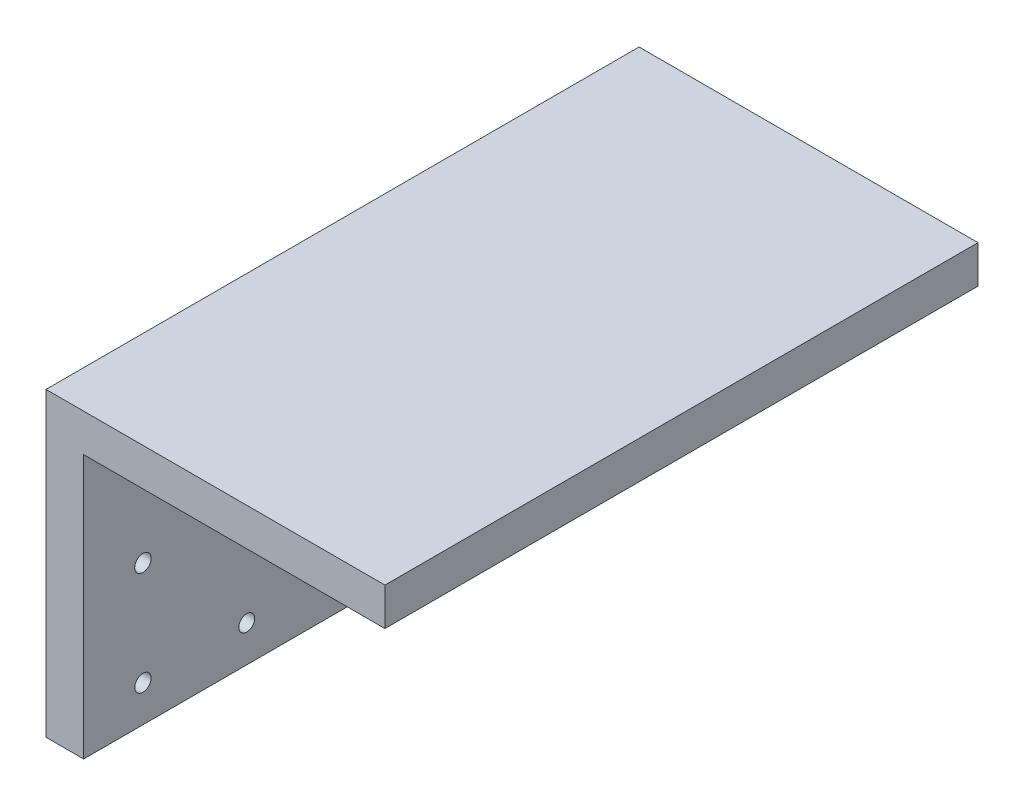
ISO-10303-21;
HEADER;
FILE_DESCRIPTION(('STEP AP214'),'2;1');
FILE_NAME('part.step','',(''),(''),'','','');
FILE_SCHEMA(('AUTOMOTIVE_DESIGN { 1 0 10303 214 1 1 1 1 }'));
ENDSEC;
DATA;
#1=APPLICATION_CONTEXT('core data for automotive mechanical design processes');
#2=APPLICATION_PROTOCOL_DEFINITION('international standard','automotive_design',2000,#1);
#3=PRODUCT_CONTEXT('',#1,'mechanical');
#4=PRODUCT('Part','Part','',(#3));
#5=PRODUCT_RELATED_PRODUCT_CATEGORY('part','',(#4));
#6=PRODUCT_DEFINITION_FORMATION('','',#4);
#7=PRODUCT_DEFINITION_CONTEXT('part definition',#1,'design');
#8=PRODUCT_DEFINITION('design','',#6,#7);
#9=PRODUCT_DEFINITION_SHAPE('','',#8);
#10=(LENGTH_UNIT() NAMED_UNIT(*) SI_UNIT(.MILLI.,.METRE.));
#11=(NAMED_UNIT(*) PLANE_ANGLE_UNIT() SI_UNIT($,.RADIAN.));
#12=(NAMED_UNIT(*) SI_UNIT($,.STERADIAN.) SOLID_ANGLE_UNIT());
#13=UNCERTAINTY_MEASURE_WITH_UNIT(LENGTH_MEASURE(1.E-05),#10,'distance_accuracy_value','');
#14=(GEOMETRIC_REPRESENTATION_CONTEXT(3) GLOBAL_UNCERTAINTY_ASSIGNED_CONTEXT((#13)) GLOBAL_UNIT_ASSIGNED_CONTEXT((#10,
#11,#12)) REPRESENTATION_CONTEXT('',''));
#15=CARTESIAN_POINT('',(0.,0.,0.));
#16=DIRECTION('',(0.,0.,1.));
#17=DIRECTION('',(1.,0.,0.));
#18=AXIS2_PLACEMENT_3D('',#15,#16,#17);
#19=CARTESIAN_POINT('',(12.7,-50.8,100.));
#20=DIRECTION('',(0.,0.,-1.));
#21=DIRECTION('',(-1.,0.,0.));
#22=AXIS2_PLACEMENT_3D('',#19,#20,#21);
#23=PLANE('',#22);
#24=DIRECTION('',(0.,-1.,0.));
#25=VECTOR('',#24,1.);
#26=CARTESIAN_POINT('',(0.,-50.8,100.));
#27=LINE('',#26,#25);
#28=CARTESIAN_POINT('',(0.,50.8,100.));
#29=VERTEX_POINT('',#28);
#30=CARTESIAN_POINT('',(0.,-50.8,100.));
#31=VERTEX_POINT('',#30);
#32=EDGE_CURVE('E95',#29,#31,#27,.T.);
#33=ORIENTED_EDGE('',*,*,#32,.T.);
#34=DIRECTION('',(-1.,0.,0.));
#35=VECTOR('',#34,1.);
#36=CARTESIAN_POINT('',(12.7,-50.8,100.));
#37=LINE('',#36,#35);
#38=CARTESIAN_POINT('',(12.7,-50.8,100.));
#39=VERTEX_POINT('',#38);
#40=EDGE_CURVE('E11',#39,#31,#37,.T.);
#41=ORIENTED_EDGE('',*,*,#40,.F.);
#42=DIRECTION('',(0.,-1.,0.));
#43=VECTOR('',#42,1.);
#44=CARTESIAN_POINT('',(12.7,-50.8,100.));
#45=LINE('',#44,#43);
#46=CARTESIAN_POINT('',(12.7,38.1,100.));
#47=VERTEX_POINT('',#46);
#48=EDGE_CURVE('E88',#47,#39,#45,.T.);
#49=ORIENTED_EDGE('',*,*,#48,.F.);
#50=DIRECTION('',(-1.,0.,0.));
#51=VECTOR('',#50,1.);
#52=CARTESIAN_POINT('',(114.3,38.1,100.));
#53=LINE('',#52,#51);
#54=CARTESIAN_POINT('',(114.3,38.1,100.));
#55=VERTEX_POINT('',#54);
#56=EDGE_CURVE('E103',#55,#47,#53,.T.);
#57=ORIENTED_EDGE('',*,*,#56,.F.);
#58=DIRECTION('',(0.,-1.,0.));
#59=VECTOR('',#58,1.);
#60=CARTESIAN_POINT('',(114.3,50.8,100.));
#61=LINE('',#60,#59);
#62=CARTESIAN_POINT('',(114.3,50.8,100.));
#63=VERTEX_POINT('',#62);
#64=EDGE_CURVE('E98',#63,#55,#61,.T.);
#65=ORIENTED_EDGE('',*,*,#64,.F.);
#66=DIRECTION('',(-1.,0.,0.));
#67=VECTOR('',#66,1.);
#68=CARTESIAN_POINT('',(12.7,50.8,100.));
#69=LINE('',#68,#67);
#70=EDGE_CURVE('E81',#63,#29,#69,.T.);
#71=ORIENTED_EDGE('',*,*,#70,.T.);
#72=EDGE_LOOP('',(#33,#41,#49,#57,#65,#71));
#73=FACE_BOUND('',#72,.T.);
#74=ADVANCED_FACE('F35',(#73),#23,.F.);
#75=CARTESIAN_POINT('',(12.7,-50.8,-100.));
#76=DIRECTION('',(0.,1.,0.));
#77=DIRECTION('',(0.,0.,1.));
#78=AXIS2_PLACEMENT_3D('',#75,#76,#77);
#79=PLANE('',#78);
#80=DIRECTION('',(0.,0.,-1.));
#81=VECTOR('',#80,1.);
#82=CARTESIAN_POINT('',(0.,-50.8,-100.));
#83=LINE('',#82,#81);
#84=CARTESIAN_POINT('',(0.,-50.8,-100.));
#85=VERTEX_POINT('',#84);
#86=EDGE_CURVE('E102',#31,#85,#83,.T.);
#87=ORIENTED_EDGE('',*,*,#86,.T.);
#88=DIRECTION('',(-1.,0.,0.));
#89=VECTOR('',#88,1.);
#90=CARTESIAN_POINT('',(12.7,-50.8,-100.));
#91=LINE('',#90,#89);
#92=CARTESIAN_POINT('',(12.7,-50.8,-100.));
#93=VERTEX_POINT('',#92);
#94=EDGE_CURVE('E43',#93,#85,#91,.T.);
#95=ORIENTED_EDGE('',*,*,#94,.F.);
#96=DIRECTION('',(0.,0.,-1.));
#97=VECTOR('',#96,1.);
#98=CARTESIAN_POINT('',(12.7,-50.8,-100.));
#99=LINE('',#98,#97);
#100=EDGE_CURVE('E57',#39,#93,#99,.T.);
#101=ORIENTED_EDGE('',*,*,#100,.F.);
#102=ORIENTED_EDGE('',*,*,#40,.T.);
#103=EDGE_LOOP('',(#87,#95,#101,#102));
#104=FACE_BOUND('',#103,.T.);
#105=ADVANCED_FACE('F182',(#104),#79,.F.);
#106=CARTESIAN_POINT('',(12.7,-50.8,-100.));
#107=DIRECTION('',(0.,0.,1.));
#108=DIRECTION('',(1.,0.,0.));
#109=AXIS2_PLACEMENT_3D('',#106,#107,#108);
#110=PLANE('',#109);
#111=DIRECTION('',(0.,1.,0.));
#112=VECTOR('',#111,1.);
#113=CARTESIAN_POINT('',(0.,-50.8,-100.));
#114=LINE('',#113,#112);
#115=CARTESIAN_POINT('',(0.,50.8,-100.));
#116=VERTEX_POINT('',#115);
#117=EDGE_CURVE('E89',#85,#116,#114,.T.);
#118=ORIENTED_EDGE('',*,*,#117,.T.);
#119=DIRECTION('',(-1.,0.,0.));
#120=VECTOR('',#119,1.);
#121=CARTESIAN_POINT('',(12.7,50.8,-100.));
#122=LINE('',#121,#120);
#123=CARTESIAN_POINT('',(114.3,50.8,-100.));
#124=VERTEX_POINT('',#123);
#125=EDGE_CURVE('E84',#124,#116,#122,.T.);
#126=ORIENTED_EDGE('',*,*,#125,.F.);
#127=DIRECTION('',(0.,1.,0.));
#128=VECTOR('',#127,1.);
#129=CARTESIAN_POINT('',(114.3,50.8,-100.));
#130=LINE('',#129,#128);
#131=CARTESIAN_POINT('',(114.3,38.1,-100.));
#132=VERTEX_POINT('',#131);
#133=EDGE_CURVE('E154',#132,#124,#130,.T.);
#134=ORIENTED_EDGE('',*,*,#133,.F.);
#135=DIRECTION('',(-1.,0.,0.));
#136=VECTOR('',#135,1.);
#137=CARTESIAN_POINT('',(114.3,38.1,-100.));
#138=LINE('',#137,#136);
#139=CARTESIAN_POINT('',(12.7,38.1,-100.));
#140=VERTEX_POINT('',#139);
#141=EDGE_CURVE('E107',#132,#140,#138,.T.);
#142=ORIENTED_EDGE('',*,*,#141,.T.);
#143=DIRECTION('',(0.,1.,0.));
#144=VECTOR('',#143,1.);
#145=CARTESIAN_POINT('',(12.7,-50.8,-100.));
#146=LINE('',#145,#144);
#147=EDGE_CURVE('E99',#93,#140,#146,.T.);
#148=ORIENTED_EDGE('',*,*,#147,.F.);
#149=ORIENTED_EDGE('',*,*,#94,.T.);
#150=EDGE_LOOP('',(#118,#126,#134,#142,#148,#149));
#151=FACE_BOUND('',#150,.T.);
#152=ADVANCED_FACE('F173',(#151),#110,.F.);
#153=CARTESIAN_POINT('',(12.7,50.8,-100.));
#154=DIRECTION('',(0.,-1.,0.));
#155=DIRECTION('',(0.,0.,-1.));
#156=AXIS2_PLACEMENT_3D('',#153,#154,#155);
#157=PLANE('',#156);
#158=DIRECTION('',(0.,0.,1.));
#159=VECTOR('',#158,1.);
#160=CARTESIAN_POINT('',(0.,50.8,-100.));
#161=LINE('',#160,#159);
#162=EDGE_CURVE('E77',#116,#29,#161,.T.);
#163=ORIENTED_EDGE('',*,*,#162,.T.);
#164=ORIENTED_EDGE('',*,*,#70,.F.);
#165=DIRECTION('',(0.,0.,1.));
#166=VECTOR('',#165,1.);
#167=CARTESIAN_POINT('',(114.3,50.8,100.));
#168=LINE('',#167,#166);
#169=EDGE_CURVE('E157',#124,#63,#168,.T.);
#170=ORIENTED_EDGE('',*,*,#169,.F.);
#171=ORIENTED_EDGE('',*,*,#125,.T.);
#172=EDGE_LOOP('',(#163,#164,#170,#171));
#173=FACE_BOUND('',#172,.T.);
#174=ADVANCED_FACE('F79',(#173),#157,.F.);
#175=CARTESIAN_POINT('',(12.7,0.,0.));
#176=DIRECTION('',(1.,0.,0.));
#177=DIRECTION('',(0.,0.,-1.));
#178=AXIS2_PLACEMENT_3D('',#175,#176,#177);
#179=PLANE('',#178);
#180=CARTESIAN_POINT('',(12.7,-3.52605628281914,45.));
#181=DIRECTION('',(1.,0.,0.));
#182=DIRECTION('',(0.,0.,-1.));
#183=AXIS2_PLACEMENT_3D('',#180,#181,#182);
#184=CIRCLE('',#183,2.83964100334553);
#185=CARTESIAN_POINT('',(12.7,-3.52605628281914,42.1603589966545));
#186=VERTEX_POINT('',#185);
#187=EDGE_CURVE('E124',#186,#186,#184,.T.);
#188=ORIENTED_EDGE('',*,*,#187,.F.);
#189=EDGE_LOOP('',(#188));
#190=FACE_BOUND('',#189,.T.);
#191=CARTESIAN_POINT('',(12.7,-38.5260562828191,80.));
#192=DIRECTION('',(1.,0.,0.));
#193=DIRECTION('',(0.,0.,-1.));
#194=AXIS2_PLACEMENT_3D('',#191,#192,#193);
#195=CIRCLE('',#194,2.75898408272224);
#196=CARTESIAN_POINT('',(12.7,-38.5260562828191,77.2410159172778));
#197=VERTEX_POINT('',#196);
#198=EDGE_CURVE('E236',#197,#197,#195,.T.);
#199=ORIENTED_EDGE('',*,*,#198,.F.);
#200=EDGE_LOOP('',(#199));
#201=FACE_BOUND('',#200,.T.);
#202=CARTESIAN_POINT('',(12.7,-38.5260562828191,45.));
#203=DIRECTION('',(1.,0.,0.));
#204=DIRECTION('',(0.,0.,-1.));
#205=AXIS2_PLACEMENT_3D('',#202,#203,#204);
#206=CIRCLE('',#205,2.68650884233547);
#207=CARTESIAN_POINT('',(12.7,-38.5260562828191,42.3134911576645));
#208=VERTEX_POINT('',#207);
#209=EDGE_CURVE('E239',#208,#208,#206,.T.);
#210=ORIENTED_EDGE('',*,*,#209,.F.);
#211=EDGE_LOOP('',(#210));
#212=FACE_BOUND('',#211,.T.);
#213=CARTESIAN_POINT('',(12.7,0.,-40.));
#214=DIRECTION('',(1.,0.,0.));
#215=DIRECTION('',(0.,0.,-1.));
#216=AXIS2_PLACEMENT_3D('',#213,#214,#215);
#217=CIRCLE('',#216,2.83730427194621);
#218=CARTESIAN_POINT('',(12.7,0.,-42.8373042719462));
#219=VERTEX_POINT('',#218);
#220=EDGE_CURVE('E244',#219,#219,#217,.T.);
#221=ORIENTED_EDGE('',*,*,#220,.F.);
#222=EDGE_LOOP('',(#221));
#223=FACE_BOUND('',#222,.T.);
#224=CARTESIAN_POINT('',(12.7,0.,-75.));
#225=DIRECTION('',(1.,0.,0.));
#226=DIRECTION('',(0.,0.,-1.));
#227=AXIS2_PLACEMENT_3D('',#224,#225,#226);
#228=CIRCLE('',#227,2.92781178652067);
#229=CARTESIAN_POINT('',(12.7,0.,-77.9278117865207));
#230=VERTEX_POINT('',#229);
#231=EDGE_CURVE('E247',#230,#230,#228,.T.);
#232=ORIENTED_EDGE('',*,*,#231,.F.);
#233=EDGE_LOOP('',(#232));
#234=FACE_BOUND('',#233,.T.);
#235=CARTESIAN_POINT('',(12.7,-35.,-40.));
#236=DIRECTION('',(1.,0.,0.));
#237=DIRECTION('',(0.,0.,-1.));
#238=AXIS2_PLACEMENT_3D('',#235,#236,#237);
#239=CIRCLE('',#238,2.62545728686266);
#240=CARTESIAN_POINT('',(12.7,-35.,-42.6254572868626));
#241=VERTEX_POINT('',#240);
#242=EDGE_CURVE('E249',#241,#241,#239,.T.);
#243=ORIENTED_EDGE('',*,*,#242,.F.);
#244=EDGE_LOOP('',(#243));
#245=FACE_BOUND('',#244,.T.);
#246=CARTESIAN_POINT('',(12.7,-35.,-75.));
#247=DIRECTION('',(1.,0.,0.));
#248=DIRECTION('',(0.,0.,-1.));
#249=AXIS2_PLACEMENT_3D('',#246,#247,#248);
#250=CIRCLE('',#249,2.7159648014371);
#251=CARTESIAN_POINT('',(12.7,-35.,-77.7159648014371));
#252=VERTEX_POINT('',#251);
#253=EDGE_CURVE('E148',#252,#252,#250,.T.);
#254=ORIENTED_EDGE('',*,*,#253,.F.);
#255=EDGE_LOOP('',(#254));
#256=FACE_BOUND('',#255,.T.);
#257=CARTESIAN_POINT('',(12.7,-3.52605628281914,80.));
#258=DIRECTION('',(1.,0.,0.));
#259=DIRECTION('',(0.,0.,-1.));
#260=AXIS2_PLACEMENT_3D('',#257,#258,#259);
#261=CIRCLE('',#260,2.78394676932842);
#262=CARTESIAN_POINT('',(12.7,-3.52605628281914,77.2160532306716));
#263=VERTEX_POINT('',#262);
#264=EDGE_CURVE('E119',#263,#263,#261,.T.);
#265=ORIENTED_EDGE('',*,*,#264,.F.);
#266=EDGE_LOOP('',(#265));
#267=FACE_BOUND('',#266,.T.);
#268=DIRECTION('',(0.,0.,-1.));
#269=VECTOR('',#268,1.);
#270=CARTESIAN_POINT('',(12.7,38.1,100.));
#271=LINE('',#270,#269);
#272=EDGE_CURVE('E51',#47,#140,#271,.T.);
#273=ORIENTED_EDGE('',*,*,#272,.F.);
#274=ORIENTED_EDGE('',*,*,#48,.T.);
#275=ORIENTED_EDGE('',*,*,#100,.T.);
#276=ORIENTED_EDGE('',*,*,#147,.T.);
#277=EDGE_LOOP('',(#273,#274,#275,#276));
#278=FACE_BOUND('',#277,.T.);
#279=ADVANCED_FACE('F164',(#190,#201,#212,#223,#234,#245,#256,#267,#278),#179,.T.);
#280=CARTESIAN_POINT('',(0.,0.,0.));
#281=DIRECTION('',(1.,0.,0.));
#282=DIRECTION('',(0.,0.,-1.));
#283=AXIS2_PLACEMENT_3D('',#280,#281,#282);
#284=PLANE('',#283);
#285=CARTESIAN_POINT('',(0.,-3.52605628281914,45.));
#286=DIRECTION('',(1.,0.,0.));
#287=DIRECTION('',(0.,0.,-1.));
#288=AXIS2_PLACEMENT_3D('',#285,#286,#287);
#289=CIRCLE('',#288,2.83964100334553);
#290=CARTESIAN_POINT('',(0.,-3.52605628281914,42.1603589966545));
#291=VERTEX_POINT('',#290);
#292=EDGE_CURVE('E38',#291,#291,#289,.T.);
#293=ORIENTED_EDGE('',*,*,#292,.T.);
#294=EDGE_LOOP('',(#293));
#295=FACE_BOUND('',#294,.T.);
#296=CARTESIAN_POINT('',(0.,-38.5260562828191,80.));
#297=DIRECTION('',(1.,0.,0.));
#298=DIRECTION('',(0.,0.,-1.));
#299=AXIS2_PLACEMENT_3D('',#296,#297,#298);
#300=CIRCLE('',#299,2.75898408272224);
#301=CARTESIAN_POINT('',(0.,-38.5260562828191,77.2410159172778));
#302=VERTEX_POINT('',#301);
#303=EDGE_CURVE('E135',#302,#302,#300,.T.);
#304=ORIENTED_EDGE('',*,*,#303,.T.);
#305=EDGE_LOOP('',(#304));
#306=FACE_BOUND('',#305,.T.);
#307=CARTESIAN_POINT('',(0.,-38.5260562828191,45.));
#308=DIRECTION('',(1.,0.,0.));
#309=DIRECTION('',(0.,0.,-1.));
#310=AXIS2_PLACEMENT_3D('',#307,#308,#309);
#311=CIRCLE('',#310,2.68650884233547);
#312=CARTESIAN_POINT('',(0.,-38.5260562828191,42.3134911576645));
#313=VERTEX_POINT('',#312);
#314=EDGE_CURVE('E133',#313,#313,#311,.T.);
#315=ORIENTED_EDGE('',*,*,#314,.T.);
#316=EDGE_LOOP('',(#315));
#317=FACE_BOUND('',#316,.T.);
#318=CARTESIAN_POINT('',(0.,0.,-40.));
#319=DIRECTION('',(1.,0.,0.));
#320=DIRECTION('',(0.,0.,-1.));
#321=AXIS2_PLACEMENT_3D('',#318,#319,#320);
#322=CIRCLE('',#321,2.83730427194621);
#323=CARTESIAN_POINT('',(0.,0.,-42.8373042719462));
#324=VERTEX_POINT('',#323);
#325=EDGE_CURVE('E130',#324,#324,#322,.T.);
#326=ORIENTED_EDGE('',*,*,#325,.T.);
#327=EDGE_LOOP('',(#326));
#328=FACE_BOUND('',#327,.T.);
#329=CARTESIAN_POINT('',(0.,0.,-75.));
#330=DIRECTION('',(1.,0.,0.));
#331=DIRECTION('',(0.,0.,-1.));
#332=AXIS2_PLACEMENT_3D('',#329,#330,#331);
#333=CIRCLE('',#332,2.92781178652067);
#334=CARTESIAN_POINT('',(0.,0.,-77.9278117865207));
#335=VERTEX_POINT('',#334);
#336=EDGE_CURVE('E127',#335,#335,#333,.T.);
#337=ORIENTED_EDGE('',*,*,#336,.T.);
#338=EDGE_LOOP('',(#337));
#339=FACE_BOUND('',#338,.T.);
#340=CARTESIAN_POINT('',(0.,-35.,-40.));
#341=DIRECTION('',(1.,0.,0.));
#342=DIRECTION('',(0.,0.,-1.));
#343=AXIS2_PLACEMENT_3D('',#340,#341,#342);
#344=CIRCLE('',#343,2.62545728686266);
#345=CARTESIAN_POINT('',(0.,-35.,-42.6254572868626));
#346=VERTEX_POINT('',#345);
#347=EDGE_CURVE('E123',#346,#346,#344,.T.);
#348=ORIENTED_EDGE('',*,*,#347,.T.);
#349=EDGE_LOOP('',(#348));
#350=FACE_BOUND('',#349,.T.);
#351=CARTESIAN_POINT('',(0.,-35.,-75.));
#352=DIRECTION('',(1.,0.,0.));
#353=DIRECTION('',(0.,0.,-1.));
#354=AXIS2_PLACEMENT_3D('',#351,#352,#353);
#355=CIRCLE('',#354,2.7159648014371);
#356=CARTESIAN_POINT('',(0.,-35.,-77.7159648014371));
#357=VERTEX_POINT('',#356);
#358=EDGE_CURVE('E120',#357,#357,#355,.T.);
#359=ORIENTED_EDGE('',*,*,#358,.T.);
#360=EDGE_LOOP('',(#359));
#361=FACE_BOUND('',#360,.T.);
#362=CARTESIAN_POINT('',(0.,-3.52605628281914,80.));
#363=DIRECTION('',(1.,0.,0.));
#364=DIRECTION('',(0.,0.,-1.));
#365=AXIS2_PLACEMENT_3D('',#362,#363,#364);
#366=CIRCLE('',#365,2.78394676932842);
#367=CARTESIAN_POINT('',(0.,-3.52605628281914,77.2160532306716));
#368=VERTEX_POINT('',#367);
#369=EDGE_CURVE('E116',#368,#368,#366,.T.);
#370=ORIENTED_EDGE('',*,*,#369,.T.);
#371=EDGE_LOOP('',(#370));
#372=FACE_BOUND('',#371,.T.);
#373=ORIENTED_EDGE('',*,*,#32,.F.);
#374=ORIENTED_EDGE('',*,*,#162,.F.);
#375=ORIENTED_EDGE('',*,*,#117,.F.);
#376=ORIENTED_EDGE('',*,*,#86,.F.);
#377=EDGE_LOOP('',(#373,#374,#375,#376));
#378=FACE_BOUND('',#377,.T.);
#379=ADVANCED_FACE('F101',(#295,#306,#317,#328,#339,#350,#361,#372,#378),#284,.F.);
#380=CARTESIAN_POINT('',(114.3,38.1,100.));
#381=DIRECTION('',(0.,1.,0.));
#382=DIRECTION('',(0.,0.,1.));
#383=AXIS2_PLACEMENT_3D('',#380,#381,#382);
#384=PLANE('',#383);
#385=ORIENTED_EDGE('',*,*,#272,.T.);
#386=ORIENTED_EDGE('',*,*,#141,.F.);
#387=DIRECTION('',(0.,0.,-1.));
#388=VECTOR('',#387,1.);
#389=CARTESIAN_POINT('',(114.3,38.1,100.));
#390=LINE('',#389,#388);
#391=EDGE_CURVE('E151',#55,#132,#390,.T.);
#392=ORIENTED_EDGE('',*,*,#391,.F.);
#393=ORIENTED_EDGE('',*,*,#56,.T.);
#394=EDGE_LOOP('',(#385,#386,#392,#393));
#395=FACE_BOUND('',#394,.T.);
#396=ADVANCED_FACE('F169',(#395),#384,.F.);
#397=CARTESIAN_POINT('',(114.3,0.,0.));
#398=DIRECTION('',(1.,0.,0.));
#399=DIRECTION('',(0.,0.,-1.));
#400=AXIS2_PLACEMENT_3D('',#397,#398,#399);
#401=PLANE('',#400);
#402=ORIENTED_EDGE('',*,*,#64,.T.);
#403=ORIENTED_EDGE('',*,*,#391,.T.);
#404=ORIENTED_EDGE('',*,*,#133,.T.);
#405=ORIENTED_EDGE('',*,*,#169,.T.);
#406=EDGE_LOOP('',(#402,#403,#404,#405));
#407=FACE_BOUND('',#406,.T.);
#408=ADVANCED_FACE('F177',(#407),#401,.T.);
#409=CARTESIAN_POINT('',(-88.9,-3.52605628281914,80.));
#410=DIRECTION('',(1.,0.,0.));
#411=DIRECTION('',(0.,0.,-1.));
#412=AXIS2_PLACEMENT_3D('',#409,#410,#411);
#413=CYLINDRICAL_SURFACE('',#412,2.78394676932842);
#414=ORIENTED_EDGE('',*,*,#264,.T.);
#415=EDGE_LOOP('',(#414));
#416=FACE_BOUND('',#415,.T.);
#417=ORIENTED_EDGE('',*,*,#369,.F.);
#418=EDGE_LOOP('',(#417));
#419=FACE_BOUND('',#418,.T.);
#420=ADVANCED_FACE('F201',(#416,#419),#413,.F.);
#421=CARTESIAN_POINT('',(-88.9,-35.,-75.));
#422=DIRECTION('',(1.,0.,0.));
#423=DIRECTION('',(0.,0.,-1.));
#424=AXIS2_PLACEMENT_3D('',#421,#422,#423);
#425=CYLINDRICAL_SURFACE('',#424,2.7159648014371);
#426=ORIENTED_EDGE('',*,*,#253,.T.);
#427=EDGE_LOOP('',(#426));
#428=FACE_BOUND('',#427,.T.);
#429=ORIENTED_EDGE('',*,*,#358,.F.);
#430=EDGE_LOOP('',(#429));
#431=FACE_BOUND('',#430,.T.);
#432=ADVANCED_FACE('F204',(#428,#431),#425,.F.);
#433=CARTESIAN_POINT('',(-88.9,-35.,-40.));
#434=DIRECTION('',(1.,0.,0.));
#435=DIRECTION('',(0.,0.,-1.));
#436=AXIS2_PLACEMENT_3D('',#433,#434,#435);
#437=CYLINDRICAL_SURFACE('',#436,2.62545728686266);
#438=ORIENTED_EDGE('',*,*,#242,.T.);
#439=EDGE_LOOP('',(#438));
#440=FACE_BOUND('',#439,.T.);
#441=ORIENTED_EDGE('',*,*,#347,.F.);
#442=EDGE_LOOP('',(#441));
#443=FACE_BOUND('',#442,.T.);
#444=ADVANCED_FACE('F207',(#440,#443),#437,.F.);
#445=CARTESIAN_POINT('',(-88.9,0.,-75.));
#446=DIRECTION('',(1.,0.,0.));
#447=DIRECTION('',(0.,0.,-1.));
#448=AXIS2_PLACEMENT_3D('',#445,#446,#447);
#449=CYLINDRICAL_SURFACE('',#448,2.92781178652067);
#450=ORIENTED_EDGE('',*,*,#231,.T.);
#451=EDGE_LOOP('',(#450));
#452=FACE_BOUND('',#451,.T.);
#453=ORIENTED_EDGE('',*,*,#336,.F.);
#454=EDGE_LOOP('',(#453));
#455=FACE_BOUND('',#454,.T.);
#456=ADVANCED_FACE('F211',(#452,#455),#449,.F.);
#457=CARTESIAN_POINT('',(-88.9,0.,-40.));
#458=DIRECTION('',(1.,0.,0.));
#459=DIRECTION('',(0.,0.,-1.));
#460=AXIS2_PLACEMENT_3D('',#457,#458,#459);
#461=CYLINDRICAL_SURFACE('',#460,2.83730427194621);
#462=ORIENTED_EDGE('',*,*,#220,.T.);
#463=EDGE_LOOP('',(#462));
#464=FACE_BOUND('',#463,.T.);
#465=ORIENTED_EDGE('',*,*,#325,.F.);
#466=EDGE_LOOP('',(#465));
#467=FACE_BOUND('',#466,.T.);
#468=ADVANCED_FACE('F215',(#464,#467),#461,.F.);
#469=CARTESIAN_POINT('',(-88.9,-38.5260562828191,45.));
#470=DIRECTION('',(1.,0.,0.));
#471=DIRECTION('',(0.,0.,-1.));
#472=AXIS2_PLACEMENT_3D('',#469,#470,#471);
#473=CYLINDRICAL_SURFACE('',#472,2.68650884233547);
#474=ORIENTED_EDGE('',*,*,#209,.T.);
#475=EDGE_LOOP('',(#474));
#476=FACE_BOUND('',#475,.T.);
#477=ORIENTED_EDGE('',*,*,#314,.F.);
#478=EDGE_LOOP('',(#477));
#479=FACE_BOUND('',#478,.T.);
#480=ADVANCED_FACE('F219',(#476,#479),#473,.F.);
#481=CARTESIAN_POINT('',(-88.9,-38.5260562828191,80.));
#482=DIRECTION('',(1.,0.,0.));
#483=DIRECTION('',(0.,0.,-1.));
#484=AXIS2_PLACEMENT_3D('',#481,#482,#483);
#485=CYLINDRICAL_SURFACE('',#484,2.75898408272224);
#486=ORIENTED_EDGE('',*,*,#198,.T.);
#487=EDGE_LOOP('',(#486));
#488=FACE_BOUND('',#487,.T.);
#489=ORIENTED_EDGE('',*,*,#303,.F.);
#490=EDGE_LOOP('',(#489));
#491=FACE_BOUND('',#490,.T.);
#492=ADVANCED_FACE('F223',(#488,#491),#485,.F.);
#493=CARTESIAN_POINT('',(-88.9,-3.52605628281914,45.));
#494=DIRECTION('',(1.,0.,0.));
#495=DIRECTION('',(0.,0.,-1.));
#496=AXIS2_PLACEMENT_3D('',#493,#494,#495);
#497=CYLINDRICAL_SURFACE('',#496,2.83964100334553);
#498=ORIENTED_EDGE('',*,*,#187,.T.);
#499=EDGE_LOOP('',(#498));
#500=FACE_BOUND('',#499,.T.);
#501=ORIENTED_EDGE('',*,*,#292,.F.);
#502=EDGE_LOOP('',(#501));
#503=FACE_BOUND('',#502,.T.);
#504=ADVANCED_FACE('F227',(#500,#503),#497,.F.);
#505=CLOSED_SHELL('',(#74,#105,#152,#174,#279,#379,#396,#408,#420,#432,#444,#456,#468,#480,#492,#504));
#506=MANIFOLD_SOLID_BREP('B2',#505);
#507=ADVANCED_BREP_SHAPE_REPRESENTATION('',(#18,#506),#14);
#508=SHAPE_DEFINITION_REPRESENTATION(#9,#507);
ENDSEC;
END-ISO-10303-21;
